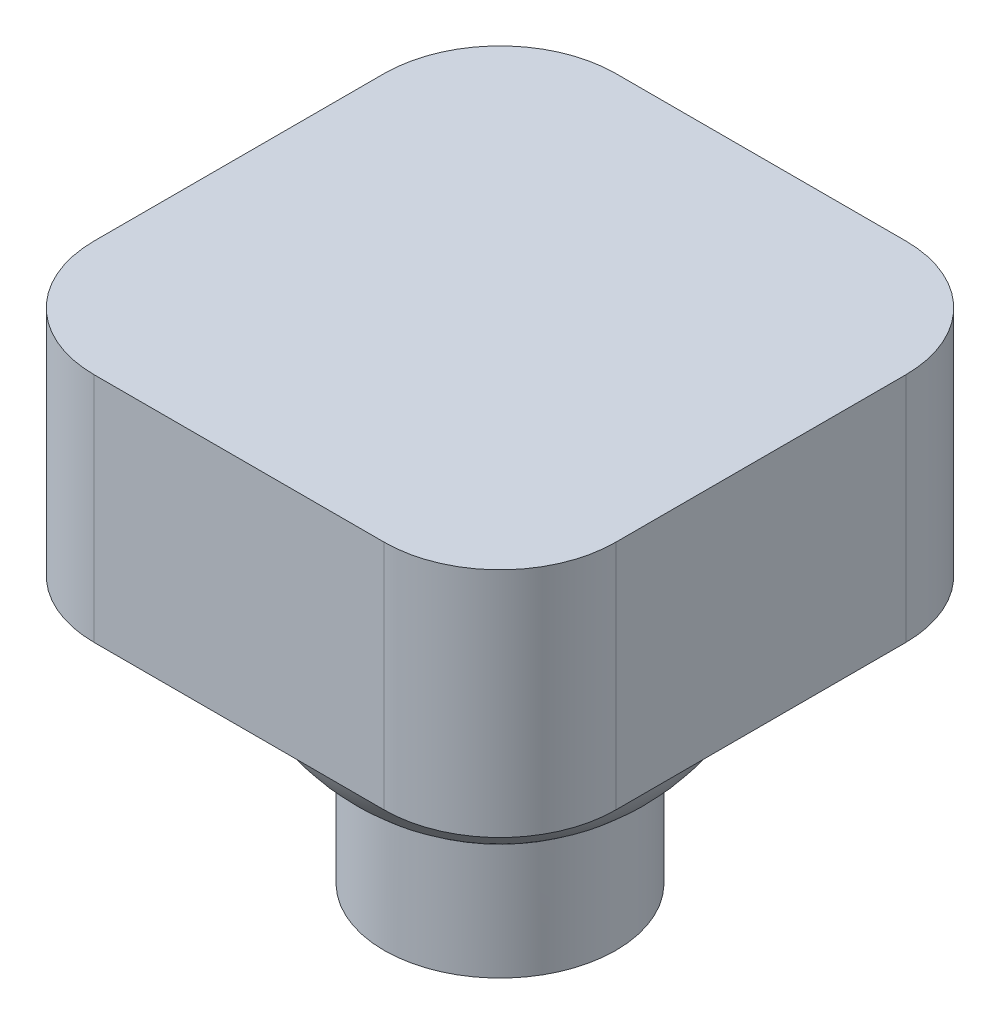
ISO-10303-21;
HEADER;
FILE_DESCRIPTION(('STEP AP214'),'2;1');
FILE_NAME('part.step','',(''),(''),'','','');
FILE_SCHEMA(('AUTOMOTIVE_DESIGN { 1 0 10303 214 1 1 1 1 }'));
ENDSEC;
DATA;
#1=APPLICATION_CONTEXT('core data for automotive mechanical design processes');
#2=APPLICATION_PROTOCOL_DEFINITION('international standard','automotive_design',2000,#1);
#3=PRODUCT_CONTEXT('',#1,'mechanical');
#4=PRODUCT('Part','Part','',(#3));
#5=PRODUCT_RELATED_PRODUCT_CATEGORY('part','',(#4));
#6=PRODUCT_DEFINITION_FORMATION('','',#4);
#7=PRODUCT_DEFINITION_CONTEXT('part definition',#1,'design');
#8=PRODUCT_DEFINITION('design','',#6,#7);
#9=PRODUCT_DEFINITION_SHAPE('','',#8);
#10=(LENGTH_UNIT() NAMED_UNIT(*) SI_UNIT(.MILLI.,.METRE.));
#11=(NAMED_UNIT(*) PLANE_ANGLE_UNIT() SI_UNIT($,.RADIAN.));
#12=(NAMED_UNIT(*) SI_UNIT($,.STERADIAN.) SOLID_ANGLE_UNIT());
#13=UNCERTAINTY_MEASURE_WITH_UNIT(LENGTH_MEASURE(1.E-05),#10,'distance_accuracy_value','');
#14=(GEOMETRIC_REPRESENTATION_CONTEXT(3) GLOBAL_UNCERTAINTY_ASSIGNED_CONTEXT((#13)) GLOBAL_UNIT_ASSIGNED_CONTEXT((#10,
#11,#12)) REPRESENTATION_CONTEXT('',''));
#15=CARTESIAN_POINT('',(0.,0.,0.));
#16=DIRECTION('',(0.,0.,1.));
#17=DIRECTION('',(1.,0.,0.));
#18=AXIS2_PLACEMENT_3D('',#15,#16,#17);
#19=CARTESIAN_POINT('',(0.,61.8779728055165,0.));
#20=DIRECTION('',(0.,1.,0.));
#21=DIRECTION('',(1.,0.,0.));
#22=AXIS2_PLACEMENT_3D('',#19,#20,#21);
#23=SPHERICAL_SURFACE('',#22,44.45);
#24=CARTESIAN_POINT('',(0.,25.4,0.));
#25=DIRECTION('',(0.,1.,0.));
#26=DIRECTION('',(0.,0.,1.));
#27=AXIS2_PLACEMENT_3D('',#24,#25,#26);
#28=CIRCLE('',#27,25.4);
#29=CARTESIAN_POINT('',(25.4,25.4,0.));
#30=VERTEX_POINT('',#29);
#31=EDGE_CURVE('E144',#30,#30,#28,.T.);
#32=CARTESIAN_POINT('',(0.,58.42,0.));
#33=DIRECTION('',(0.,1.,0.));
#34=DIRECTION('',(0.,0.,1.));
#35=AXIS2_PLACEMENT_3D('',#32,#33,#34);
#36=CIRCLE('',#35,44.3152899581658);
#37=CARTESIAN_POINT('',(44.3152899581658,58.42,0.));
#38=VERTEX_POINT('',#37);
#39=EDGE_CURVE('E147',#38,#38,#36,.T.);
#40=CARTESIAN_POINT('',(25.4,25.4,0.));
#41=CARTESIAN_POINT('',(25.7361596527616,25.6340696444292,0.));
#42=CARTESIAN_POINT('',(26.0690819189959,25.8727885010688,0.));
#43=CARTESIAN_POINT('',(26.728201292203,26.3593367036376,0.));
#44=CARTESIAN_POINT('',(27.0543983991758,26.6071660495669,0.));
#45=CARTESIAN_POINT('',(27.6998170676528,27.1117472955846,0.));
#46=CARTESIAN_POINT('',(28.0190386291571,27.368499195673,0.));
#47=CARTESIAN_POINT('',(28.6502625288351,27.8907289300324,0.));
#48=CARTESIAN_POINT('',(28.9622648670089,28.1562067643035,0.));
#49=CARTESIAN_POINT('',(29.5788117905219,28.6956855780589,0.));
#50=CARTESIAN_POINT('',(29.883356375861,28.9696865575433,0.));
#51=CARTESIAN_POINT('',(30.4847550627562,29.5260022248908,0.));
#52=CARTESIAN_POINT('',(30.7816091643123,29.8083169127538,0.));
#53=CARTESIAN_POINT('',(31.3674000037423,30.3810442420645,0.));
#54=CARTESIAN_POINT('',(31.6563367416163,30.6714568835121,0.));
#55=CARTESIAN_POINT('',(32.2260720318228,31.2601581666226,0.));
#56=CARTESIAN_POINT('',(32.5068705841552,31.5584468082855,0.));
#57=CARTESIAN_POINT('',(33.0601148992222,32.1626721217069,0.));
#58=CARTESIAN_POINT('',(33.3325606619568,32.4686087934654,0.));
#59=CARTESIAN_POINT('',(33.868891178001,33.0878963511693,0.));
#60=CARTESIAN_POINT('',(34.1327759313107,33.4012472371147,0.));
#61=CARTESIAN_POINT('',(34.6517827513955,34.0351237410666,0.));
#62=CARTESIAN_POINT('',(34.9069048181705,34.3556493590732,0.));
#63=CARTESIAN_POINT('',(35.4081912851009,35.0036303615974,0.));
#64=CARTESIAN_POINT('',(35.6543556852562,35.3310857461151,0.));
#65=CARTESIAN_POINT('',(36.1375386848562,35.9926760199679,0.));
#66=CARTESIAN_POINT('',(36.3745572843008,36.3268109093029,0.));
#67=CARTESIAN_POINT('',(36.8392675381787,37.0015048262016,0.));
#68=CARTESIAN_POINT('',(37.0669591926119,37.3420638537651,0.));
#69=CARTESIAN_POINT('',(37.512841540395,38.0293457708084,0.));
#70=CARTESIAN_POINT('',(37.7310322337448,38.3760686602881,0.));
#71=CARTESIAN_POINT('',(38.1577459045123,39.0754133140457,0.));
#72=CARTESIAN_POINT('',(38.36626888193,39.4280350783235,0.));
#73=CARTESIAN_POINT('',(38.7734877546522,40.138907986274,0.));
#74=CARTESIAN_POINT('',(38.9721836499567,40.4971591299467,0.));
#75=CARTESIAN_POINT('',(39.3595965027367,41.2190169989625,0.));
#76=CARTESIAN_POINT('',(39.5483134602121,41.5826237243058,0.));
#77=CARTESIAN_POINT('',(39.9156242081403,42.3149148658714,0.));
#78=CARTESIAN_POINT('',(40.0942179985932,42.6835992820938,0.));
#79=CARTESIAN_POINT('',(40.441145920035,43.4257640339403,0.));
#80=CARTESIAN_POINT('',(40.6094800510239,43.7992443695644,0.));
#81=CARTESIAN_POINT('',(40.9357600021624,44.550715523398,0.));
#82=CARTESIAN_POINT('',(41.0937058223122,44.9287063416075,0.));
#83=CARTESIAN_POINT('',(41.3990884397925,45.688909576605,0.));
#84=CARTESIAN_POINT('',(41.5465252371232,46.071121993393,0.));
#85=CARTESIAN_POINT('',(41.8307771286157,46.8394763151351,0.));
#86=CARTESIAN_POINT('',(41.9675922227776,47.2256182200892,0.));
#87=CARTESIAN_POINT('',(42.2304961454076,48.001536404586,0.));
#88=CARTESIAN_POINT('',(42.3565849738758,48.3913126841288,0.));
#89=CARTESIAN_POINT('',(42.597940000042,49.1742017266358,0.));
#90=CARTESIAN_POINT('',(42.71320619774,49.5673144896,0.));
#91=CARTESIAN_POINT('',(42.9328278694678,50.3565760577445,0.));
#92=CARTESIAN_POINT('',(43.0371833434977,50.7527248629249,0.));
#93=CARTESIAN_POINT('',(43.2349038104572,51.5477557543026,0.));
#94=CARTESIAN_POINT('',(43.3282688033869,51.9466378404999,0.));
#95=CARTESIAN_POINT('',(43.503936962208,52.7468304425101,0.));
#96=CARTESIAN_POINT('',(43.5862401280993,53.1481409583231,0.));
#97=CARTESIAN_POINT('',(43.739721696676,53.952883716906,0.));
#98=CARTESIAN_POINT('',(43.8109000993614,54.3563159596758,0.));
#99=CARTESIAN_POINT('',(43.9420778731574,55.1649938304227,0.));
#100=CARTESIAN_POINT('',(44.0020772442681,55.5702394583998,0.));
#101=CARTESIAN_POINT('',(44.1108506123557,56.3822344373537,0.));
#102=CARTESIAN_POINT('',(44.1596246093326,56.7889837883305,0.));
#103=CARTESIAN_POINT('',(44.2459117717511,57.6036751575997,0.));
#104=CARTESIAN_POINT('',(44.2834249371926,58.011617175892,0.));
#105=CARTESIAN_POINT('',(44.3152899581658,58.42,0.));
#106=B_SPLINE_CURVE_WITH_KNOTS('',3,(#40,#41,#42,#43,#44,#45,#46,#47,#48,#49,#50,#51,#52,#53,
#54,#55,#56,#57,#58,#59,#60,#61,#62,#63,#64,#65,#66,#67,#68,#69,#70,#71,#72,#73,#74,#75,#76,#77,
#78,#79,#80,#81,#82,#83,#84,#85,#86,#87,#88,#89,#90,#91,#92,#93,#94,#95,#96,#97,#98,#99,#100,
#101,#102,#103,#104,#105),.UNSPECIFIED.,.F.,.F.,(4,2,2,2,2,2,2,2,2,2,2,2,2,2,2,2,2,2,2,2,2,2,2,
2,2,2,2,2,2,2,2,2,4),(0.,1.22883306715073,2.45766613430147,3.68649920145221,4.91533226860294,
6.14416533575368,7.37299840290441,8.60183147005515,9.83066453720589,11.0594976043566,
12.2883306715074,13.5171637386581,14.7459968058088,15.9748298729596,17.2036629401103,
18.432496007261,19.6613290744118,20.8901621415625,22.1189952087132,23.347828275864,
24.5766613430147,25.8054944101654,27.0343274773162,28.2631605444669,29.4919936116177,
30.7208266787684,31.9496597459191,33.1784928130699,34.4073258802206,35.6361589473713,
36.8649920145221,38.0938250816728,39.3226581488235),.UNSPECIFIED.);
#107=EDGE_CURVE('BSEAM40',#30,#38,#106,.T.);
#108=ORIENTED_EDGE('',*,*,#31,.T.);
#109=ORIENTED_EDGE('',*,*,#39,.F.);
#110=ORIENTED_EDGE('',*,*,#107,.T.);
#111=ORIENTED_EDGE('',*,*,#107,.F.);
#112=EDGE_LOOP('',(#108,#110,#109,#111));
#113=FACE_BOUND('',#112,.T.);
#114=ADVANCED_FACE('F40',(#113),#23,.T.);
#115=CARTESIAN_POINT('',(0.,25.4,0.));
#116=DIRECTION('',(0.,-1.,0.));
#117=DIRECTION('',(0.,0.,-1.));
#118=AXIS2_PLACEMENT_3D('',#115,#116,#117);
#119=CYLINDRICAL_SURFACE('',#118,25.4);
#120=ORIENTED_EDGE('',*,*,#31,.F.);
#121=EDGE_LOOP('',(#120));
#122=FACE_BOUND('',#121,.T.);
#123=CARTESIAN_POINT('',(0.,0.,0.));
#124=DIRECTION('',(0.,1.,0.));
#125=DIRECTION('',(0.,0.,1.));
#126=AXIS2_PLACEMENT_3D('',#123,#124,#125);
#127=CIRCLE('',#126,25.4);
#128=CARTESIAN_POINT('',(0.,0.,25.4));
#129=VERTEX_POINT('',#128);
#130=EDGE_CURVE('E148',#129,#129,#127,.T.);
#131=ORIENTED_EDGE('',*,*,#130,.T.);
#132=EDGE_LOOP('',(#131));
#133=FACE_BOUND('',#132,.T.);
#134=ADVANCED_FACE('F197',(#122,#133),#119,.T.);
#135=CARTESIAN_POINT('',(0.,0.,0.));
#136=DIRECTION('',(0.,1.,0.));
#137=DIRECTION('',(0.,0.,1.));
#138=AXIS2_PLACEMENT_3D('',#135,#136,#137);
#139=PLANE('',#138);
#140=ORIENTED_EDGE('',*,*,#130,.F.);
#141=EDGE_LOOP('',(#140));
#142=FACE_BOUND('',#141,.T.);
#143=ADVANCED_FACE('F203',(#142),#139,.F.);
#144=CARTESIAN_POINT('',(-57.15,109.22,-57.15));
#145=DIRECTION('',(1.,0.,0.));
#146=DIRECTION('',(0.,0.,-1.));
#147=AXIS2_PLACEMENT_3D('',#144,#145,#146);
#148=PLANE('',#147);
#149=DIRECTION('',(0.,0.,1.));
#150=VECTOR('',#149,1.);
#151=CARTESIAN_POINT('',(-57.15,109.22,-57.15));
#152=LINE('',#151,#150);
#153=CARTESIAN_POINT('',(-57.15,109.22,-31.75));
#154=VERTEX_POINT('',#153);
#155=CARTESIAN_POINT('',(-57.15,109.22,31.75));
#156=VERTEX_POINT('',#155);
#157=EDGE_CURVE('E126',#154,#156,#152,.T.);
#158=ORIENTED_EDGE('',*,*,#157,.F.);
#159=DIRECTION('',(0.,-1.,0.));
#160=VECTOR('',#159,1.);
#161=CARTESIAN_POINT('',(-57.15,109.22,-31.75));
#162=LINE('',#161,#160);
#163=CARTESIAN_POINT('',(-57.15,58.42,-31.75));
#164=VERTEX_POINT('',#163);
#165=EDGE_CURVE('E110',#154,#164,#162,.T.);
#166=ORIENTED_EDGE('',*,*,#165,.T.);
#167=DIRECTION('',(0.,0.,1.));
#168=VECTOR('',#167,1.);
#169=CARTESIAN_POINT('',(-57.15,58.42,-57.15));
#170=LINE('',#169,#168);
#171=CARTESIAN_POINT('',(-57.15,58.42,31.75));
#172=VERTEX_POINT('',#171);
#173=EDGE_CURVE('E123',#164,#172,#170,.T.);
#174=ORIENTED_EDGE('',*,*,#173,.T.);
#175=DIRECTION('',(0.,-1.,0.));
#176=VECTOR('',#175,1.);
#177=CARTESIAN_POINT('',(-57.15,109.22,31.75));
#178=LINE('',#177,#176);
#179=EDGE_CURVE('E128',#172,#156,#178,.F.);
#180=ORIENTED_EDGE('',*,*,#179,.T.);
#181=EDGE_LOOP('',(#158,#166,#174,#180));
#182=FACE_BOUND('',#181,.T.);
#183=ADVANCED_FACE('F122',(#182),#148,.F.);
#184=CARTESIAN_POINT('',(-57.15,109.22,57.15));
#185=DIRECTION('',(0.,0.,-1.));
#186=DIRECTION('',(-1.,0.,0.));
#187=AXIS2_PLACEMENT_3D('',#184,#185,#186);
#188=PLANE('',#187);
#189=DIRECTION('',(1.,0.,0.));
#190=VECTOR('',#189,1.);
#191=CARTESIAN_POINT('',(-57.15,58.42,57.15));
#192=LINE('',#191,#190);
#193=CARTESIAN_POINT('',(-31.75,58.42,57.15));
#194=VERTEX_POINT('',#193);
#195=CARTESIAN_POINT('',(31.75,58.42,57.15));
#196=VERTEX_POINT('',#195);
#197=EDGE_CURVE('E132',#194,#196,#192,.T.);
#198=ORIENTED_EDGE('',*,*,#197,.T.);
#199=DIRECTION('',(0.,-1.,0.));
#200=VECTOR('',#199,1.);
#201=CARTESIAN_POINT('',(31.75,109.22,57.15));
#202=LINE('',#201,#200);
#203=CARTESIAN_POINT('',(31.75,109.22,57.15));
#204=VERTEX_POINT('',#203);
#205=EDGE_CURVE('E11',#196,#204,#202,.F.);
#206=ORIENTED_EDGE('',*,*,#205,.T.);
#207=DIRECTION('',(1.,0.,0.));
#208=VECTOR('',#207,1.);
#209=CARTESIAN_POINT('',(-57.15,109.22,57.15));
#210=LINE('',#209,#208);
#211=CARTESIAN_POINT('',(-31.75,109.22,57.15));
#212=VERTEX_POINT('',#211);
#213=EDGE_CURVE('E177',#212,#204,#210,.T.);
#214=ORIENTED_EDGE('',*,*,#213,.F.);
#215=DIRECTION('',(0.,-1.,0.));
#216=VECTOR('',#215,1.);
#217=CARTESIAN_POINT('',(-31.75,109.22,57.15));
#218=LINE('',#217,#216);
#219=EDGE_CURVE('E48',#212,#194,#218,.T.);
#220=ORIENTED_EDGE('',*,*,#219,.T.);
#221=EDGE_LOOP('',(#198,#206,#214,#220));
#222=FACE_BOUND('',#221,.T.);
#223=ADVANCED_FACE('F175',(#222),#188,.F.);
#224=CARTESIAN_POINT('',(57.15,109.22,-57.15));
#225=DIRECTION('',(-1.,0.,0.));
#226=DIRECTION('',(0.,0.,1.));
#227=AXIS2_PLACEMENT_3D('',#224,#225,#226);
#228=PLANE('',#227);
#229=DIRECTION('',(0.,0.,-1.));
#230=VECTOR('',#229,1.);
#231=CARTESIAN_POINT('',(57.15,58.42,-57.15));
#232=LINE('',#231,#230);
#233=CARTESIAN_POINT('',(57.15,58.42,31.75));
#234=VERTEX_POINT('',#233);
#235=CARTESIAN_POINT('',(57.15,58.42,-31.75));
#236=VERTEX_POINT('',#235);
#237=EDGE_CURVE('E135',#234,#236,#232,.T.);
#238=ORIENTED_EDGE('',*,*,#237,.T.);
#239=DIRECTION('',(0.,-1.,0.));
#240=VECTOR('',#239,1.);
#241=CARTESIAN_POINT('',(57.15,109.22,-31.75));
#242=LINE('',#241,#240);
#243=CARTESIAN_POINT('',(57.15,109.22,-31.75));
#244=VERTEX_POINT('',#243);
#245=EDGE_CURVE('E55',#236,#244,#242,.F.);
#246=ORIENTED_EDGE('',*,*,#245,.T.);
#247=DIRECTION('',(0.,0.,-1.));
#248=VECTOR('',#247,1.);
#249=CARTESIAN_POINT('',(57.15,109.22,-57.15));
#250=LINE('',#249,#248);
#251=CARTESIAN_POINT('',(57.15,109.22,31.75));
#252=VERTEX_POINT('',#251);
#253=EDGE_CURVE('E185',#252,#244,#250,.T.);
#254=ORIENTED_EDGE('',*,*,#253,.F.);
#255=DIRECTION('',(0.,-1.,0.));
#256=VECTOR('',#255,1.);
#257=CARTESIAN_POINT('',(57.15,109.22,31.75));
#258=LINE('',#257,#256);
#259=EDGE_CURVE('E168',#252,#234,#258,.T.);
#260=ORIENTED_EDGE('',*,*,#259,.T.);
#261=EDGE_LOOP('',(#238,#246,#254,#260));
#262=FACE_BOUND('',#261,.T.);
#263=ADVANCED_FACE('F184',(#262),#228,.F.);
#264=CARTESIAN_POINT('',(-57.15,109.22,-57.15));
#265=DIRECTION('',(0.,0.,1.));
#266=DIRECTION('',(1.,0.,0.));
#267=AXIS2_PLACEMENT_3D('',#264,#265,#266);
#268=PLANE('',#267);
#269=DIRECTION('',(-1.,0.,0.));
#270=VECTOR('',#269,1.);
#271=CARTESIAN_POINT('',(-57.15,58.42,-57.15));
#272=LINE('',#271,#270);
#273=CARTESIAN_POINT('',(31.75,58.42,-57.15));
#274=VERTEX_POINT('',#273);
#275=CARTESIAN_POINT('',(-31.75,58.42,-57.15));
#276=VERTEX_POINT('',#275);
#277=EDGE_CURVE('E142',#274,#276,#272,.T.);
#278=ORIENTED_EDGE('',*,*,#277,.T.);
#279=DIRECTION('',(0.,-1.,0.));
#280=VECTOR('',#279,1.);
#281=CARTESIAN_POINT('',(-31.75,109.22,-57.15));
#282=LINE('',#281,#280);
#283=CARTESIAN_POINT('',(-31.75,109.22,-57.15));
#284=VERTEX_POINT('',#283);
#285=EDGE_CURVE('E111',#276,#284,#282,.F.);
#286=ORIENTED_EDGE('',*,*,#285,.T.);
#287=DIRECTION('',(-1.,0.,0.));
#288=VECTOR('',#287,1.);
#289=CARTESIAN_POINT('',(-57.15,109.22,-57.15));
#290=LINE('',#289,#288);
#291=CARTESIAN_POINT('',(31.75,109.22,-57.15));
#292=VERTEX_POINT('',#291);
#293=EDGE_CURVE('E138',#292,#284,#290,.T.);
#294=ORIENTED_EDGE('',*,*,#293,.F.);
#295=DIRECTION('',(0.,-1.,0.));
#296=VECTOR('',#295,1.);
#297=CARTESIAN_POINT('',(31.75,109.22,-57.15));
#298=LINE('',#297,#296);
#299=EDGE_CURVE('E116',#292,#274,#298,.T.);
#300=ORIENTED_EDGE('',*,*,#299,.T.);
#301=EDGE_LOOP('',(#278,#286,#294,#300));
#302=FACE_BOUND('',#301,.T.);
#303=ADVANCED_FACE('F222',(#302),#268,.F.);
#304=CARTESIAN_POINT('',(0.,109.22,0.));
#305=DIRECTION('',(0.,1.,0.));
#306=DIRECTION('',(0.,0.,1.));
#307=AXIS2_PLACEMENT_3D('',#304,#305,#306);
#308=PLANE('',#307);
#309=ORIENTED_EDGE('',*,*,#293,.T.);
#310=CARTESIAN_POINT('',(-31.75,109.22,-31.75));
#311=DIRECTION('',(0.,1.,0.));
#312=DIRECTION('',(0.,0.,1.));
#313=AXIS2_PLACEMENT_3D('',#310,#311,#312);
#314=CIRCLE('',#313,25.4);
#315=EDGE_CURVE('E166',#284,#154,#314,.T.);
#316=ORIENTED_EDGE('',*,*,#315,.T.);
#317=ORIENTED_EDGE('',*,*,#157,.T.);
#318=CARTESIAN_POINT('',(-31.75,109.22,31.75));
#319=DIRECTION('',(0.,1.,0.));
#320=DIRECTION('',(0.,0.,1.));
#321=AXIS2_PLACEMENT_3D('',#318,#319,#320);
#322=CIRCLE('',#321,25.4);
#323=EDGE_CURVE('E161',#156,#212,#322,.T.);
#324=ORIENTED_EDGE('',*,*,#323,.T.);
#325=ORIENTED_EDGE('',*,*,#213,.T.);
#326=CARTESIAN_POINT('',(31.75,109.22,31.75));
#327=DIRECTION('',(0.,1.,0.));
#328=DIRECTION('',(0.,0.,1.));
#329=AXIS2_PLACEMENT_3D('',#326,#327,#328);
#330=CIRCLE('',#329,25.4);
#331=EDGE_CURVE('E62',#204,#252,#330,.T.);
#332=ORIENTED_EDGE('',*,*,#331,.T.);
#333=ORIENTED_EDGE('',*,*,#253,.T.);
#334=CARTESIAN_POINT('',(31.75,109.22,-31.75));
#335=DIRECTION('',(0.,1.,0.));
#336=DIRECTION('',(0.,0.,1.));
#337=AXIS2_PLACEMENT_3D('',#334,#335,#336);
#338=CIRCLE('',#337,25.4);
#339=EDGE_CURVE('E164',#244,#292,#338,.T.);
#340=ORIENTED_EDGE('',*,*,#339,.T.);
#341=EDGE_LOOP('',(#309,#316,#317,#324,#325,#332,#333,#340));
#342=FACE_BOUND('',#341,.T.);
#343=ADVANCED_FACE('F190',(#342),#308,.T.);
#344=CARTESIAN_POINT('',(0.,58.42,0.));
#345=DIRECTION('',(0.,1.,0.));
#346=DIRECTION('',(0.,0.,1.));
#347=AXIS2_PLACEMENT_3D('',#344,#345,#346);
#348=PLANE('',#347);
#349=ORIENTED_EDGE('',*,*,#39,.T.);
#350=EDGE_LOOP('',(#349));
#351=FACE_BOUND('',#350,.T.);
#352=ORIENTED_EDGE('',*,*,#173,.F.);
#353=CARTESIAN_POINT('',(-31.75,58.42,-31.75));
#354=DIRECTION('',(0.,1.,0.));
#355=DIRECTION('',(0.,0.,1.));
#356=AXIS2_PLACEMENT_3D('',#353,#354,#355);
#357=CIRCLE('',#356,25.4);
#358=EDGE_CURVE('E106',#164,#276,#357,.F.);
#359=ORIENTED_EDGE('',*,*,#358,.T.);
#360=ORIENTED_EDGE('',*,*,#277,.F.);
#361=CARTESIAN_POINT('',(31.75,58.42,-31.75));
#362=DIRECTION('',(0.,1.,0.));
#363=DIRECTION('',(0.,0.,1.));
#364=AXIS2_PLACEMENT_3D('',#361,#362,#363);
#365=CIRCLE('',#364,25.4);
#366=EDGE_CURVE('E117',#274,#236,#365,.F.);
#367=ORIENTED_EDGE('',*,*,#366,.T.);
#368=ORIENTED_EDGE('',*,*,#237,.F.);
#369=CARTESIAN_POINT('',(31.75,58.42,31.75));
#370=DIRECTION('',(0.,1.,0.));
#371=DIRECTION('',(0.,0.,1.));
#372=AXIS2_PLACEMENT_3D('',#369,#370,#371);
#373=CIRCLE('',#372,25.4);
#374=EDGE_CURVE('E155',#234,#196,#373,.F.);
#375=ORIENTED_EDGE('',*,*,#374,.T.);
#376=ORIENTED_EDGE('',*,*,#197,.F.);
#377=CARTESIAN_POINT('',(-31.75,58.42,31.75));
#378=DIRECTION('',(0.,1.,0.));
#379=DIRECTION('',(0.,0.,1.));
#380=AXIS2_PLACEMENT_3D('',#377,#378,#379);
#381=CIRCLE('',#380,25.4);
#382=EDGE_CURVE('E127',#194,#172,#381,.F.);
#383=ORIENTED_EDGE('',*,*,#382,.T.);
#384=EDGE_LOOP('',(#352,#359,#360,#367,#368,#375,#376,#383));
#385=FACE_BOUND('',#384,.T.);
#386=ADVANCED_FACE('F130',(#351,#385),#348,.F.);
#387=CARTESIAN_POINT('',(-31.75,109.22,-31.75));
#388=DIRECTION('',(0.,-1.,0.));
#389=DIRECTION('',(0.,0.,-1.));
#390=AXIS2_PLACEMENT_3D('',#387,#388,#389);
#391=CYLINDRICAL_SURFACE('',#390,25.4);
#392=ORIENTED_EDGE('',*,*,#315,.F.);
#393=ORIENTED_EDGE('',*,*,#285,.F.);
#394=ORIENTED_EDGE('',*,*,#358,.F.);
#395=ORIENTED_EDGE('',*,*,#165,.F.);
#396=EDGE_LOOP('',(#392,#393,#394,#395));
#397=FACE_BOUND('',#396,.T.);
#398=ADVANCED_FACE('F109',(#397),#391,.T.);
#399=CARTESIAN_POINT('',(31.75,109.22,-31.75));
#400=DIRECTION('',(0.,-1.,0.));
#401=DIRECTION('',(0.,0.,-1.));
#402=AXIS2_PLACEMENT_3D('',#399,#400,#401);
#403=CYLINDRICAL_SURFACE('',#402,25.4);
#404=ORIENTED_EDGE('',*,*,#339,.F.);
#405=ORIENTED_EDGE('',*,*,#245,.F.);
#406=ORIENTED_EDGE('',*,*,#366,.F.);
#407=ORIENTED_EDGE('',*,*,#299,.F.);
#408=EDGE_LOOP('',(#404,#405,#406,#407));
#409=FACE_BOUND('',#408,.T.);
#410=ADVANCED_FACE('F195',(#409),#403,.T.);
#411=CARTESIAN_POINT('',(31.75,109.22,31.75));
#412=DIRECTION('',(0.,-1.,0.));
#413=DIRECTION('',(0.,0.,-1.));
#414=AXIS2_PLACEMENT_3D('',#411,#412,#413);
#415=CYLINDRICAL_SURFACE('',#414,25.4);
#416=ORIENTED_EDGE('',*,*,#331,.F.);
#417=ORIENTED_EDGE('',*,*,#205,.F.);
#418=ORIENTED_EDGE('',*,*,#374,.F.);
#419=ORIENTED_EDGE('',*,*,#259,.F.);
#420=EDGE_LOOP('',(#416,#417,#418,#419));
#421=FACE_BOUND('',#420,.T.);
#422=ADVANCED_FACE('F183',(#421),#415,.T.);
#423=CARTESIAN_POINT('',(-31.75,109.22,31.75));
#424=DIRECTION('',(0.,-1.,0.));
#425=DIRECTION('',(0.,0.,-1.));
#426=AXIS2_PLACEMENT_3D('',#423,#424,#425);
#427=CYLINDRICAL_SURFACE('',#426,25.4);
#428=ORIENTED_EDGE('',*,*,#323,.F.);
#429=ORIENTED_EDGE('',*,*,#179,.F.);
#430=ORIENTED_EDGE('',*,*,#382,.F.);
#431=ORIENTED_EDGE('',*,*,#219,.F.);
#432=EDGE_LOOP('',(#428,#429,#430,#431));
#433=FACE_BOUND('',#432,.T.);
#434=ADVANCED_FACE('F42',(#433),#427,.T.);
#435=CLOSED_SHELL('',(#114,#134,#143,#183,#223,#263,#303,#343,#386,#398,#410,#422,#434));
#436=MANIFOLD_SOLID_BREP('B2',#435);
#437=ADVANCED_BREP_SHAPE_REPRESENTATION('',(#18,#436),#14);
#438=SHAPE_DEFINITION_REPRESENTATION(#9,#437);
ENDSEC;
END-ISO-10303-21;
